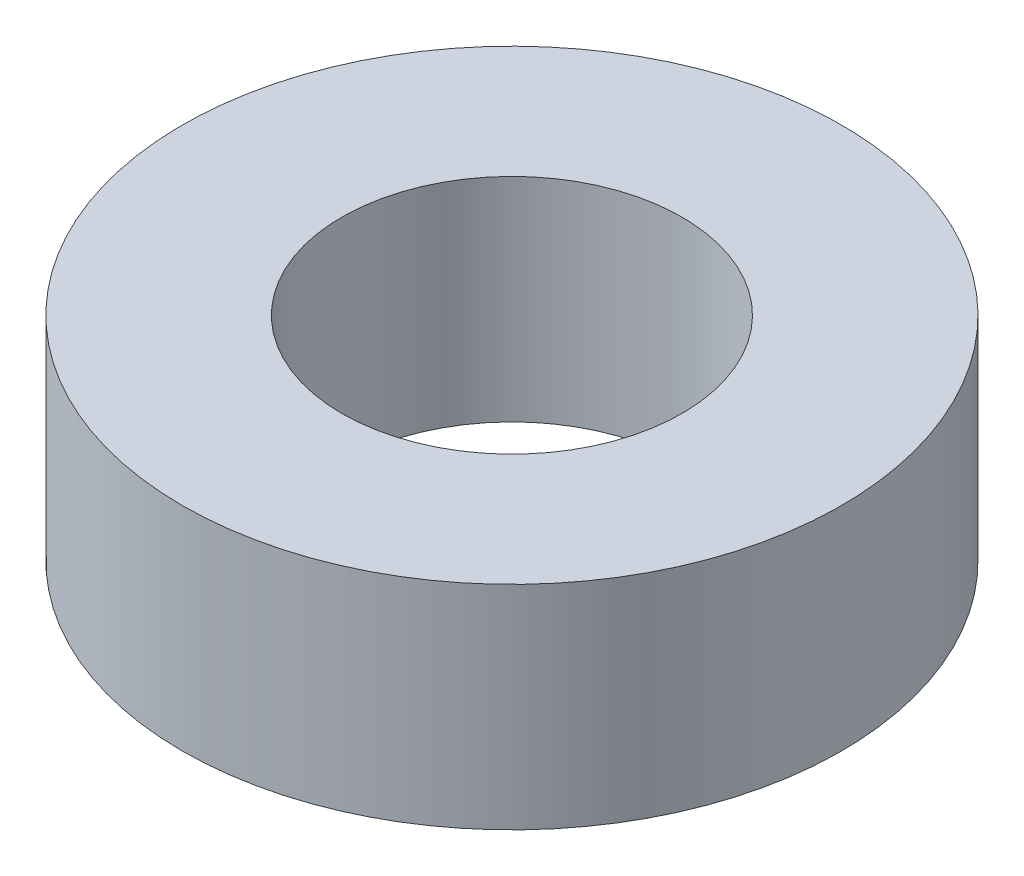
ISO-10303-21;
HEADER;
FILE_DESCRIPTION(('STEP AP214'),'2;1');
FILE_NAME('part.step','',(''),(''),'','','');
FILE_SCHEMA(('AUTOMOTIVE_DESIGN { 1 0 10303 214 1 1 1 1 }'));
ENDSEC;
DATA;
#1=APPLICATION_CONTEXT('core data for automotive mechanical design processes');
#2=APPLICATION_PROTOCOL_DEFINITION('international standard','automotive_design',2000,#1);
#3=PRODUCT_CONTEXT('',#1,'mechanical');
#4=PRODUCT('Part','Part','',(#3));
#5=PRODUCT_RELATED_PRODUCT_CATEGORY('part','',(#4));
#6=PRODUCT_DEFINITION_FORMATION('','',#4);
#7=PRODUCT_DEFINITION_CONTEXT('part definition',#1,'design');
#8=PRODUCT_DEFINITION('design','',#6,#7);
#9=PRODUCT_DEFINITION_SHAPE('','',#8);
#10=(LENGTH_UNIT() NAMED_UNIT(*) SI_UNIT(.MILLI.,.METRE.));
#11=(NAMED_UNIT(*) PLANE_ANGLE_UNIT() SI_UNIT($,.RADIAN.));
#12=(NAMED_UNIT(*) SI_UNIT($,.STERADIAN.) SOLID_ANGLE_UNIT());
#13=UNCERTAINTY_MEASURE_WITH_UNIT(LENGTH_MEASURE(1.E-05),#10,'distance_accuracy_value','');
#14=(GEOMETRIC_REPRESENTATION_CONTEXT(3) GLOBAL_UNCERTAINTY_ASSIGNED_CONTEXT((#13)) GLOBAL_UNIT_ASSIGNED_CONTEXT((#10,
#11,#12)) REPRESENTATION_CONTEXT('',''));
#15=CARTESIAN_POINT('',(0.,0.,0.));
#16=DIRECTION('',(0.,0.,1.));
#17=DIRECTION('',(1.,0.,0.));
#18=AXIS2_PLACEMENT_3D('',#15,#16,#17);
#19=CARTESIAN_POINT('',(0.,2.,0.));
#20=DIRECTION('',(0.,1.,0.));
#21=DIRECTION('',(0.,0.,1.));
#22=AXIS2_PLACEMENT_3D('',#19,#20,#21);
#23=PLANE('',#22);
#24=CARTESIAN_POINT('',(0.,2.,0.));
#25=DIRECTION('',(0.,1.,0.));
#26=DIRECTION('',(0.,0.,1.));
#27=AXIS2_PLACEMENT_3D('',#24,#25,#26);
#28=CIRCLE('',#27,3.10000000000001);
#29=CARTESIAN_POINT('',(0.,2.,3.10000000000001));
#30=VERTEX_POINT('',#29);
#31=EDGE_CURVE('E10',#30,#30,#28,.T.);
#32=ORIENTED_EDGE('',*,*,#31,.T.);
#33=EDGE_LOOP('',(#32));
#34=FACE_BOUND('',#33,.T.);
#35=CARTESIAN_POINT('',(0.,2.,0.));
#36=DIRECTION('',(0.,1.,0.));
#37=DIRECTION('',(0.,0.,1.));
#38=AXIS2_PLACEMENT_3D('',#35,#36,#37);
#39=CIRCLE('',#38,1.6);
#40=CARTESIAN_POINT('',(0.,2.,1.6));
#41=VERTEX_POINT('',#40);
#42=EDGE_CURVE('E50',#41,#41,#39,.T.);
#43=ORIENTED_EDGE('',*,*,#42,.F.);
#44=EDGE_LOOP('',(#43));
#45=FACE_BOUND('',#44,.T.);
#46=ADVANCED_FACE('F37',(#34,#45),#23,.T.);
#47=CARTESIAN_POINT('',(0.,0.,0.));
#48=DIRECTION('',(0.,1.,0.));
#49=DIRECTION('',(0.,0.,1.));
#50=AXIS2_PLACEMENT_3D('',#47,#48,#49);
#51=PLANE('',#50);
#52=CARTESIAN_POINT('',(0.,0.,0.));
#53=DIRECTION('',(0.,1.,0.));
#54=DIRECTION('',(0.,0.,1.));
#55=AXIS2_PLACEMENT_3D('',#52,#53,#54);
#56=CIRCLE('',#55,3.10000000000001);
#57=CARTESIAN_POINT('',(0.,0.,3.10000000000001));
#58=VERTEX_POINT('',#57);
#59=EDGE_CURVE('E41',#58,#58,#56,.T.);
#60=ORIENTED_EDGE('',*,*,#59,.F.);
#61=EDGE_LOOP('',(#60));
#62=FACE_BOUND('',#61,.T.);
#63=CARTESIAN_POINT('',(0.,0.,0.));
#64=DIRECTION('',(0.,1.,0.));
#65=DIRECTION('',(0.,0.,1.));
#66=AXIS2_PLACEMENT_3D('',#63,#64,#65);
#67=CIRCLE('',#66,1.6);
#68=CARTESIAN_POINT('',(0.,0.,1.6));
#69=VERTEX_POINT('',#68);
#70=EDGE_CURVE('E52',#69,#69,#67,.T.);
#71=ORIENTED_EDGE('',*,*,#70,.T.);
#72=EDGE_LOOP('',(#71));
#73=FACE_BOUND('',#72,.T.);
#74=ADVANCED_FACE('F64',(#62,#73),#51,.F.);
#75=CARTESIAN_POINT('',(0.,2.,0.));
#76=DIRECTION('',(0.,-1.,0.));
#77=DIRECTION('',(0.,0.,-1.));
#78=AXIS2_PLACEMENT_3D('',#75,#76,#77);
#79=CYLINDRICAL_SURFACE('',#78,3.10000000000001);
#80=ORIENTED_EDGE('',*,*,#31,.F.);
#81=EDGE_LOOP('',(#80));
#82=FACE_BOUND('',#81,.T.);
#83=ORIENTED_EDGE('',*,*,#59,.T.);
#84=EDGE_LOOP('',(#83));
#85=FACE_BOUND('',#84,.T.);
#86=ADVANCED_FACE('F39',(#82,#85),#79,.T.);
#87=CARTESIAN_POINT('',(0.,2.,0.));
#88=DIRECTION('',(0.,-1.,0.));
#89=DIRECTION('',(0.,0.,-1.));
#90=AXIS2_PLACEMENT_3D('',#87,#88,#89);
#91=CYLINDRICAL_SURFACE('',#90,1.6);
#92=ORIENTED_EDGE('',*,*,#42,.T.);
#93=EDGE_LOOP('',(#92));
#94=FACE_BOUND('',#93,.T.);
#95=ORIENTED_EDGE('',*,*,#70,.F.);
#96=EDGE_LOOP('',(#95));
#97=FACE_BOUND('',#96,.T.);
#98=ADVANCED_FACE('F60',(#94,#97),#91,.F.);
#99=CLOSED_SHELL('',(#46,#74,#86,#98));
#100=MANIFOLD_SOLID_BREP('B2',#99);
#101=ADVANCED_BREP_SHAPE_REPRESENTATION('',(#18,#100),#14);
#102=SHAPE_DEFINITION_REPRESENTATION(#9,#101);
ENDSEC;
END-ISO-10303-21;
